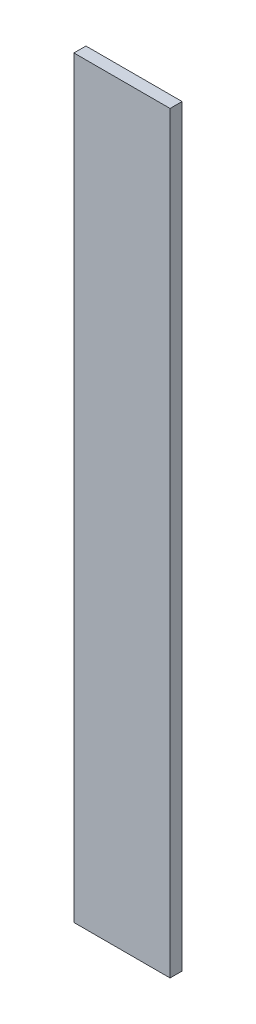
ISO-10303-21;
HEADER;
FILE_DESCRIPTION(('STEP AP214'),'2;1');
FILE_NAME('part.step','',(''),(''),'','','');
FILE_SCHEMA(('AUTOMOTIVE_DESIGN { 1 0 10303 214 1 1 1 1 }'));
ENDSEC;
DATA;
#1=APPLICATION_CONTEXT('core data for automotive mechanical design processes');
#2=APPLICATION_PROTOCOL_DEFINITION('international standard','automotive_design',2000,#1);
#3=PRODUCT_CONTEXT('',#1,'mechanical');
#4=PRODUCT('Part','Part','',(#3));
#5=PRODUCT_RELATED_PRODUCT_CATEGORY('part','',(#4));
#6=PRODUCT_DEFINITION_FORMATION('','',#4);
#7=PRODUCT_DEFINITION_CONTEXT('part definition',#1,'design');
#8=PRODUCT_DEFINITION('design','',#6,#7);
#9=PRODUCT_DEFINITION_SHAPE('','',#8);
#10=(LENGTH_UNIT() NAMED_UNIT(*) SI_UNIT(.MILLI.,.METRE.));
#11=(NAMED_UNIT(*) PLANE_ANGLE_UNIT() SI_UNIT($,.RADIAN.));
#12=(NAMED_UNIT(*) SI_UNIT($,.STERADIAN.) SOLID_ANGLE_UNIT());
#13=UNCERTAINTY_MEASURE_WITH_UNIT(LENGTH_MEASURE(1.E-05),#10,'distance_accuracy_value','');
#14=(GEOMETRIC_REPRESENTATION_CONTEXT(3) GLOBAL_UNCERTAINTY_ASSIGNED_CONTEXT((#13)) GLOBAL_UNIT_ASSIGNED_CONTEXT((#10,
#11,#12)) REPRESENTATION_CONTEXT('',''));
#15=CARTESIAN_POINT('',(0.,0.,0.));
#16=DIRECTION('',(0.,0.,1.));
#17=DIRECTION('',(1.,0.,0.));
#18=AXIS2_PLACEMENT_3D('',#15,#16,#17);
#19=CARTESIAN_POINT('',(0.,188.,3.));
#20=DIRECTION('',(1.,0.,0.));
#21=DIRECTION('',(0.,0.,-1.));
#22=AXIS2_PLACEMENT_3D('',#19,#20,#21);
#23=PLANE('',#22);
#24=DIRECTION('',(0.,-1.,0.));
#25=VECTOR('',#24,1.);
#26=CARTESIAN_POINT('',(0.,188.,0.));
#27=LINE('',#26,#25);
#28=CARTESIAN_POINT('',(0.,188.,0.));
#29=VERTEX_POINT('',#28);
#30=CARTESIAN_POINT('',(0.,0.,0.));
#31=VERTEX_POINT('',#30);
#32=EDGE_CURVE('E102',#29,#31,#27,.T.);
#33=ORIENTED_EDGE('',*,*,#32,.T.);
#34=DIRECTION('',(0.,0.,-1.));
#35=VECTOR('',#34,1.);
#36=CARTESIAN_POINT('',(0.,0.,3.));
#37=LINE('',#36,#35);
#38=CARTESIAN_POINT('',(0.,0.,3.));
#39=VERTEX_POINT('',#38);
#40=EDGE_CURVE('E11',#39,#31,#37,.T.);
#41=ORIENTED_EDGE('',*,*,#40,.F.);
#42=DIRECTION('',(0.,-1.,0.));
#43=VECTOR('',#42,1.);
#44=CARTESIAN_POINT('',(0.,188.,3.));
#45=LINE('',#44,#43);
#46=CARTESIAN_POINT('',(0.,188.,3.));
#47=VERTEX_POINT('',#46);
#48=EDGE_CURVE('E90',#47,#39,#45,.T.);
#49=ORIENTED_EDGE('',*,*,#48,.F.);
#50=DIRECTION('',(0.,0.,-1.));
#51=VECTOR('',#50,1.);
#52=CARTESIAN_POINT('',(0.,188.,3.));
#53=LINE('',#52,#51);
#54=EDGE_CURVE('E98',#47,#29,#53,.T.);
#55=ORIENTED_EDGE('',*,*,#54,.T.);
#56=EDGE_LOOP('',(#33,#41,#49,#55));
#57=FACE_BOUND('',#56,.T.);
#58=ADVANCED_FACE('F39',(#57),#23,.F.);
#59=CARTESIAN_POINT('',(0.,0.,3.));
#60=DIRECTION('',(0.,1.,0.));
#61=DIRECTION('',(0.,0.,1.));
#62=AXIS2_PLACEMENT_3D('',#59,#60,#61);
#63=PLANE('',#62);
#64=DIRECTION('',(1.,0.,0.));
#65=VECTOR('',#64,1.);
#66=CARTESIAN_POINT('',(0.,0.,0.));
#67=LINE('',#66,#65);
#68=CARTESIAN_POINT('',(24.,0.,0.));
#69=VERTEX_POINT('',#68);
#70=EDGE_CURVE('E94',#31,#69,#67,.T.);
#71=ORIENTED_EDGE('',*,*,#70,.T.);
#72=DIRECTION('',(0.,0.,-1.));
#73=VECTOR('',#72,1.);
#74=CARTESIAN_POINT('',(24.,0.,3.));
#75=LINE('',#74,#73);
#76=CARTESIAN_POINT('',(24.,0.,3.));
#77=VERTEX_POINT('',#76);
#78=EDGE_CURVE('E47',#77,#69,#75,.T.);
#79=ORIENTED_EDGE('',*,*,#78,.F.);
#80=DIRECTION('',(1.,0.,0.));
#81=VECTOR('',#80,1.);
#82=CARTESIAN_POINT('',(0.,0.,3.));
#83=LINE('',#82,#81);
#84=EDGE_CURVE('E85',#39,#77,#83,.T.);
#85=ORIENTED_EDGE('',*,*,#84,.F.);
#86=ORIENTED_EDGE('',*,*,#40,.T.);
#87=EDGE_LOOP('',(#71,#79,#85,#86));
#88=FACE_BOUND('',#87,.T.);
#89=ADVANCED_FACE('F93',(#88),#63,.F.);
#90=CARTESIAN_POINT('',(24.,0.,3.));
#91=DIRECTION('',(-1.,0.,0.));
#92=DIRECTION('',(0.,0.,1.));
#93=AXIS2_PLACEMENT_3D('',#90,#91,#92);
#94=PLANE('',#93);
#95=DIRECTION('',(0.,1.,0.));
#96=VECTOR('',#95,1.);
#97=CARTESIAN_POINT('',(24.,0.,0.));
#98=LINE('',#97,#96);
#99=CARTESIAN_POINT('',(24.,188.,0.));
#100=VERTEX_POINT('',#99);
#101=EDGE_CURVE('E72',#69,#100,#98,.T.);
#102=ORIENTED_EDGE('',*,*,#101,.T.);
#103=DIRECTION('',(0.,0.,-1.));
#104=VECTOR('',#103,1.);
#105=CARTESIAN_POINT('',(24.,188.,3.));
#106=LINE('',#105,#104);
#107=CARTESIAN_POINT('',(24.,188.,3.));
#108=VERTEX_POINT('',#107);
#109=EDGE_CURVE('E95',#108,#100,#106,.T.);
#110=ORIENTED_EDGE('',*,*,#109,.F.);
#111=DIRECTION('',(0.,1.,0.));
#112=VECTOR('',#111,1.);
#113=CARTESIAN_POINT('',(24.,0.,3.));
#114=LINE('',#113,#112);
#115=EDGE_CURVE('E88',#77,#108,#114,.T.);
#116=ORIENTED_EDGE('',*,*,#115,.F.);
#117=ORIENTED_EDGE('',*,*,#78,.T.);
#118=EDGE_LOOP('',(#102,#110,#116,#117));
#119=FACE_BOUND('',#118,.T.);
#120=ADVANCED_FACE('F96',(#119),#94,.F.);
#121=CARTESIAN_POINT('',(24.,188.,3.));
#122=DIRECTION('',(0.,-1.,0.));
#123=DIRECTION('',(0.,0.,-1.));
#124=AXIS2_PLACEMENT_3D('',#121,#122,#123);
#125=PLANE('',#124);
#126=DIRECTION('',(-1.,0.,0.));
#127=VECTOR('',#126,1.);
#128=CARTESIAN_POINT('',(24.,188.,0.));
#129=LINE('',#128,#127);
#130=EDGE_CURVE('E78',#100,#29,#129,.T.);
#131=ORIENTED_EDGE('',*,*,#130,.T.);
#132=ORIENTED_EDGE('',*,*,#54,.F.);
#133=DIRECTION('',(-1.,0.,0.));
#134=VECTOR('',#133,1.);
#135=CARTESIAN_POINT('',(24.,188.,3.));
#136=LINE('',#135,#134);
#137=EDGE_CURVE('E55',#108,#47,#136,.T.);
#138=ORIENTED_EDGE('',*,*,#137,.F.);
#139=ORIENTED_EDGE('',*,*,#109,.T.);
#140=EDGE_LOOP('',(#131,#132,#138,#139));
#141=FACE_BOUND('',#140,.T.);
#142=ADVANCED_FACE('F109',(#141),#125,.F.);
#143=CARTESIAN_POINT('',(0.,0.,3.));
#144=DIRECTION('',(0.,0.,1.));
#145=DIRECTION('',(1.,0.,0.));
#146=AXIS2_PLACEMENT_3D('',#143,#144,#145);
#147=PLANE('',#146);
#148=ORIENTED_EDGE('',*,*,#48,.T.);
#149=ORIENTED_EDGE('',*,*,#84,.T.);
#150=ORIENTED_EDGE('',*,*,#115,.T.);
#151=ORIENTED_EDGE('',*,*,#137,.T.);
#152=EDGE_LOOP('',(#148,#149,#150,#151));
#153=FACE_BOUND('',#152,.T.);
#154=ADVANCED_FACE('F86',(#153),#147,.T.);
#155=CARTESIAN_POINT('',(0.,0.,0.));
#156=DIRECTION('',(0.,0.,1.));
#157=DIRECTION('',(1.,0.,0.));
#158=AXIS2_PLACEMENT_3D('',#155,#156,#157);
#159=PLANE('',#158);
#160=ORIENTED_EDGE('',*,*,#32,.F.);
#161=ORIENTED_EDGE('',*,*,#130,.F.);
#162=ORIENTED_EDGE('',*,*,#101,.F.);
#163=ORIENTED_EDGE('',*,*,#70,.F.);
#164=EDGE_LOOP('',(#160,#161,#162,#163));
#165=FACE_BOUND('',#164,.T.);
#166=ADVANCED_FACE('F112',(#165),#159,.F.);
#167=CLOSED_SHELL('',(#58,#89,#120,#142,#154,#166));
#168=MANIFOLD_SOLID_BREP('B2',#167);
#169=ADVANCED_BREP_SHAPE_REPRESENTATION('',(#18,#168),#14);
#170=SHAPE_DEFINITION_REPRESENTATION(#9,#169);
ENDSEC;
END-ISO-10303-21;
